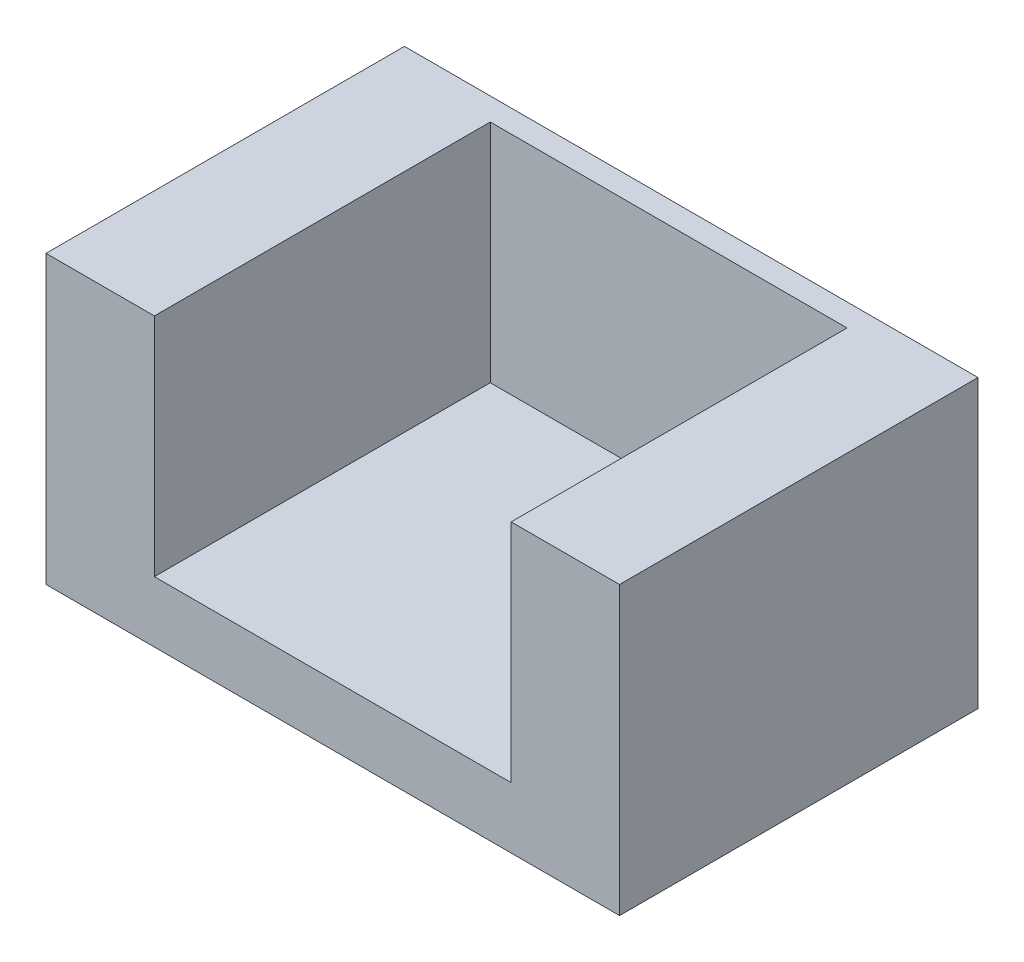
ISO-10303-21;
HEADER;
FILE_DESCRIPTION(('STEP AP214'),'2;1');
FILE_NAME('part.step','',(''),(''),'','','');
FILE_SCHEMA(('AUTOMOTIVE_DESIGN { 1 0 10303 214 1 1 1 1 }'));
ENDSEC;
DATA;
#1=APPLICATION_CONTEXT('core data for automotive mechanical design processes');
#2=APPLICATION_PROTOCOL_DEFINITION('international standard','automotive_design',2000,#1);
#3=PRODUCT_CONTEXT('',#1,'mechanical');
#4=PRODUCT('Part','Part','',(#3));
#5=PRODUCT_RELATED_PRODUCT_CATEGORY('part','',(#4));
#6=PRODUCT_DEFINITION_FORMATION('','',#4);
#7=PRODUCT_DEFINITION_CONTEXT('part definition',#1,'design');
#8=PRODUCT_DEFINITION('design','',#6,#7);
#9=PRODUCT_DEFINITION_SHAPE('','',#8);
#10=(LENGTH_UNIT() NAMED_UNIT(*) SI_UNIT(.MILLI.,.METRE.));
#11=(NAMED_UNIT(*) PLANE_ANGLE_UNIT() SI_UNIT($,.RADIAN.));
#12=(NAMED_UNIT(*) SI_UNIT($,.STERADIAN.) SOLID_ANGLE_UNIT());
#13=UNCERTAINTY_MEASURE_WITH_UNIT(LENGTH_MEASURE(1.E-05),#10,'distance_accuracy_value','');
#14=(GEOMETRIC_REPRESENTATION_CONTEXT(3) GLOBAL_UNCERTAINTY_ASSIGNED_CONTEXT((#13)) GLOBAL_UNIT_ASSIGNED_CONTEXT((#10,
#11,#12)) REPRESENTATION_CONTEXT('',''));
#15=CARTESIAN_POINT('',(0.,0.,0.));
#16=DIRECTION('',(0.,0.,1.));
#17=DIRECTION('',(1.,0.,0.));
#18=AXIS2_PLACEMENT_3D('',#15,#16,#17);
#19=CARTESIAN_POINT('',(-19.0931202727902,12.7,-5.97680945074069));
#20=DIRECTION('',(1.,0.,0.));
#21=DIRECTION('',(0.,0.,-1.));
#22=AXIS2_PLACEMENT_3D('',#19,#20,#21);
#23=PLANE('',#22);
#24=DIRECTION('',(0.,0.,1.));
#25=VECTOR('',#24,1.);
#26=CARTESIAN_POINT('',(-19.0931202727902,0.,-5.97680945074069));
#27=LINE('',#26,#25);
#28=CARTESIAN_POINT('',(-19.0931202727902,0.,-5.97680945074069));
#29=VERTEX_POINT('',#28);
#30=CARTESIAN_POINT('',(-19.0931202727902,0.,9.89819054925931));
#31=VERTEX_POINT('',#30);
#32=EDGE_CURVE('E141',#29,#31,#27,.T.);
#33=ORIENTED_EDGE('',*,*,#32,.T.);
#34=DIRECTION('',(0.,-1.,0.));
#35=VECTOR('',#34,1.);
#36=CARTESIAN_POINT('',(-19.0931202727902,12.7,9.89819054925931));
#37=LINE('',#36,#35);
#38=CARTESIAN_POINT('',(-19.0931202727902,12.7,9.89819054925931));
#39=VERTEX_POINT('',#38);
#40=EDGE_CURVE('E11',#39,#31,#37,.T.);
#41=ORIENTED_EDGE('',*,*,#40,.F.);
#42=DIRECTION('',(0.,0.,1.));
#43=VECTOR('',#42,1.);
#44=CARTESIAN_POINT('',(-19.0931202727902,12.7,-5.97680945074069));
#45=LINE('',#44,#43);
#46=CARTESIAN_POINT('',(-19.0931202727902,12.7,-5.97680945074069));
#47=VERTEX_POINT('',#46);
#48=EDGE_CURVE('E145',#47,#39,#45,.T.);
#49=ORIENTED_EDGE('',*,*,#48,.F.);
#50=DIRECTION('',(0.,-1.,0.));
#51=VECTOR('',#50,1.);
#52=CARTESIAN_POINT('',(-19.0931202727902,12.7,-5.97680945074069));
#53=LINE('',#52,#51);
#54=EDGE_CURVE('E152',#47,#29,#53,.T.);
#55=ORIENTED_EDGE('',*,*,#54,.T.);
#56=EDGE_LOOP('',(#33,#41,#49,#55));
#57=FACE_BOUND('',#56,.T.);
#58=ADVANCED_FACE('F35',(#57),#23,.F.);
#59=CARTESIAN_POINT('',(-19.0931202727902,12.7,9.89819054925931));
#60=DIRECTION('',(0.,0.,-1.));
#61=DIRECTION('',(-1.,0.,0.));
#62=AXIS2_PLACEMENT_3D('',#59,#60,#61);
#63=PLANE('',#62);
#64=DIRECTION('',(1.,0.,0.));
#65=VECTOR('',#64,1.);
#66=CARTESIAN_POINT('',(-14.2931202727902,2.7,9.89819054925931));
#67=LINE('',#66,#65);
#68=CARTESIAN_POINT('',(-14.2931202727902,2.7,9.89819054925931));
#69=VERTEX_POINT('',#68);
#70=CARTESIAN_POINT('',(1.50687972720984,2.7,9.89819054925931));
#71=VERTEX_POINT('',#70);
#72=EDGE_CURVE('E123',#69,#71,#67,.T.);
#73=ORIENTED_EDGE('',*,*,#72,.F.);
#74=DIRECTION('',(0.,1.,0.));
#75=VECTOR('',#74,1.);
#76=CARTESIAN_POINT('',(-14.2931202727902,2.7,9.89819054925931));
#77=LINE('',#76,#75);
#78=CARTESIAN_POINT('',(-14.2931202727902,12.7,9.89819054925931));
#79=VERTEX_POINT('',#78);
#80=EDGE_CURVE('E109',#69,#79,#77,.T.);
#81=ORIENTED_EDGE('',*,*,#80,.T.);
#82=DIRECTION('',(1.,0.,0.));
#83=VECTOR('',#82,1.);
#84=CARTESIAN_POINT('',(-19.0931202727902,12.7,9.89819054925931));
#85=LINE('',#84,#83);
#86=EDGE_CURVE('E86',#39,#79,#85,.T.);
#87=ORIENTED_EDGE('',*,*,#86,.F.);
#88=ORIENTED_EDGE('',*,*,#40,.T.);
#89=DIRECTION('',(1.,0.,0.));
#90=VECTOR('',#89,1.);
#91=CARTESIAN_POINT('',(-19.0931202727902,0.,9.89819054925931));
#92=LINE('',#91,#90);
#93=CARTESIAN_POINT('',(6.30687972720984,0.,9.89819054925931));
#94=VERTEX_POINT('',#93);
#95=EDGE_CURVE('E155',#31,#94,#92,.T.);
#96=ORIENTED_EDGE('',*,*,#95,.T.);
#97=DIRECTION('',(0.,-1.,0.));
#98=VECTOR('',#97,1.);
#99=CARTESIAN_POINT('',(6.30687972720984,12.7,9.89819054925931));
#100=LINE('',#99,#98);
#101=CARTESIAN_POINT('',(6.30687972720984,12.7,9.89819054925931));
#102=VERTEX_POINT('',#101);
#103=EDGE_CURVE('E42',#102,#94,#100,.T.);
#104=ORIENTED_EDGE('',*,*,#103,.F.);
#105=CARTESIAN_POINT('',(1.50687972720984,12.7,9.89819054925931));
#106=VERTEX_POINT('',#105);
#107=EDGE_CURVE('E147',#106,#102,#85,.T.);
#108=ORIENTED_EDGE('',*,*,#107,.F.);
#109=DIRECTION('',(0.,1.,0.));
#110=VECTOR('',#109,1.);
#111=CARTESIAN_POINT('',(1.50687972720984,2.7,9.89819054925931));
#112=LINE('',#111,#110);
#113=EDGE_CURVE('E49',#71,#106,#112,.T.);
#114=ORIENTED_EDGE('',*,*,#113,.F.);
#115=EDGE_LOOP('',(#73,#81,#87,#88,#96,#104,#108,#114));
#116=FACE_BOUND('',#115,.T.);
#117=ADVANCED_FACE('F127',(#116),#63,.F.);
#118=CARTESIAN_POINT('',(6.30687972720984,12.7,-5.97680945074069));
#119=DIRECTION('',(-1.,0.,0.));
#120=DIRECTION('',(0.,0.,1.));
#121=AXIS2_PLACEMENT_3D('',#118,#119,#120);
#122=PLANE('',#121);
#123=DIRECTION('',(0.,0.,-1.));
#124=VECTOR('',#123,1.);
#125=CARTESIAN_POINT('',(6.30687972720984,0.,-5.97680945074069));
#126=LINE('',#125,#124);
#127=CARTESIAN_POINT('',(6.30687972720984,0.,-5.97680945074069));
#128=VERTEX_POINT('',#127);
#129=EDGE_CURVE('E157',#94,#128,#126,.T.);
#130=ORIENTED_EDGE('',*,*,#129,.T.);
#131=DIRECTION('',(0.,-1.,0.));
#132=VECTOR('',#131,1.);
#133=CARTESIAN_POINT('',(6.30687972720984,12.7,-5.97680945074069));
#134=LINE('',#133,#132);
#135=CARTESIAN_POINT('',(6.30687972720984,12.7,-5.97680945074069));
#136=VERTEX_POINT('',#135);
#137=EDGE_CURVE('E161',#136,#128,#134,.T.);
#138=ORIENTED_EDGE('',*,*,#137,.F.);
#139=DIRECTION('',(0.,0.,-1.));
#140=VECTOR('',#139,1.);
#141=CARTESIAN_POINT('',(6.30687972720984,12.7,-5.97680945074069));
#142=LINE('',#141,#140);
#143=EDGE_CURVE('E149',#102,#136,#142,.T.);
#144=ORIENTED_EDGE('',*,*,#143,.F.);
#145=ORIENTED_EDGE('',*,*,#103,.T.);
#146=EDGE_LOOP('',(#130,#138,#144,#145));
#147=FACE_BOUND('',#146,.T.);
#148=ADVANCED_FACE('F167',(#147),#122,.F.);
#149=CARTESIAN_POINT('',(-19.0931202727902,12.7,-5.97680945074069));
#150=DIRECTION('',(0.,0.,1.));
#151=DIRECTION('',(1.,0.,0.));
#152=AXIS2_PLACEMENT_3D('',#149,#150,#151);
#153=PLANE('',#152);
#154=DIRECTION('',(-1.,0.,0.));
#155=VECTOR('',#154,1.);
#156=CARTESIAN_POINT('',(-19.0931202727902,0.,-5.97680945074069));
#157=LINE('',#156,#155);
#158=EDGE_CURVE('E79',#128,#29,#157,.T.);
#159=ORIENTED_EDGE('',*,*,#158,.T.);
#160=ORIENTED_EDGE('',*,*,#54,.F.);
#161=DIRECTION('',(-1.,0.,0.));
#162=VECTOR('',#161,1.);
#163=CARTESIAN_POINT('',(-19.0931202727902,12.7,-5.97680945074069));
#164=LINE('',#163,#162);
#165=EDGE_CURVE('E58',#136,#47,#164,.T.);
#166=ORIENTED_EDGE('',*,*,#165,.F.);
#167=ORIENTED_EDGE('',*,*,#137,.T.);
#168=EDGE_LOOP('',(#159,#160,#166,#167));
#169=FACE_BOUND('',#168,.T.);
#170=ADVANCED_FACE('F175',(#169),#153,.F.);
#171=CARTESIAN_POINT('',(0.,12.7,0.));
#172=DIRECTION('',(0.,1.,0.));
#173=DIRECTION('',(0.,0.,1.));
#174=AXIS2_PLACEMENT_3D('',#171,#172,#173);
#175=PLANE('',#174);
#176=DIRECTION('',(0.,0.,1.));
#177=VECTOR('',#176,1.);
#178=CARTESIAN_POINT('',(-14.2931202727902,12.7,-4.97680945074069));
#179=LINE('',#178,#177);
#180=CARTESIAN_POINT('',(-14.2931202727902,12.7,-4.97680945074069));
#181=VERTEX_POINT('',#180);
#182=EDGE_CURVE('E115',#181,#79,#179,.T.);
#183=ORIENTED_EDGE('',*,*,#182,.F.);
#184=DIRECTION('',(-1.,0.,0.));
#185=VECTOR('',#184,1.);
#186=CARTESIAN_POINT('',(-14.2931202727902,12.7,-4.97680945074069));
#187=LINE('',#186,#185);
#188=CARTESIAN_POINT('',(1.50687972720984,12.7,-4.97680945074069));
#189=VERTEX_POINT('',#188);
#190=EDGE_CURVE('E125',#189,#181,#187,.T.);
#191=ORIENTED_EDGE('',*,*,#190,.F.);
#192=DIRECTION('',(0.,0.,-1.));
#193=VECTOR('',#192,1.);
#194=CARTESIAN_POINT('',(1.50687972720984,12.7,-4.97680945074069));
#195=LINE('',#194,#193);
#196=EDGE_CURVE('E135',#106,#189,#195,.T.);
#197=ORIENTED_EDGE('',*,*,#196,.F.);
#198=ORIENTED_EDGE('',*,*,#107,.T.);
#199=ORIENTED_EDGE('',*,*,#143,.T.);
#200=ORIENTED_EDGE('',*,*,#165,.T.);
#201=ORIENTED_EDGE('',*,*,#48,.T.);
#202=ORIENTED_EDGE('',*,*,#86,.T.);
#203=EDGE_LOOP('',(#183,#191,#197,#198,#199,#200,#201,#202));
#204=FACE_BOUND('',#203,.T.);
#205=ADVANCED_FACE('F177',(#204),#175,.T.);
#206=CARTESIAN_POINT('',(0.,0.,0.));
#207=DIRECTION('',(0.,1.,0.));
#208=DIRECTION('',(0.,0.,1.));
#209=AXIS2_PLACEMENT_3D('',#206,#207,#208);
#210=PLANE('',#209);
#211=ORIENTED_EDGE('',*,*,#32,.F.);
#212=ORIENTED_EDGE('',*,*,#158,.F.);
#213=ORIENTED_EDGE('',*,*,#129,.F.);
#214=ORIENTED_EDGE('',*,*,#95,.F.);
#215=EDGE_LOOP('',(#211,#212,#213,#214));
#216=FACE_BOUND('',#215,.T.);
#217=ADVANCED_FACE('F171',(#216),#210,.F.);
#218=CARTESIAN_POINT('',(-14.2931202727902,2.7,-4.97680945074069));
#219=DIRECTION('',(-1.,0.,0.));
#220=DIRECTION('',(0.,0.,1.));
#221=AXIS2_PLACEMENT_3D('',#218,#219,#220);
#222=PLANE('',#221);
#223=ORIENTED_EDGE('',*,*,#182,.T.);
#224=ORIENTED_EDGE('',*,*,#80,.F.);
#225=DIRECTION('',(0.,0.,1.));
#226=VECTOR('',#225,1.);
#227=CARTESIAN_POINT('',(-14.2931202727902,2.7,-4.97680945074069));
#228=LINE('',#227,#226);
#229=CARTESIAN_POINT('',(-14.2931202727902,2.7,-4.97680945074069));
#230=VERTEX_POINT('',#229);
#231=EDGE_CURVE('E112',#230,#69,#228,.T.);
#232=ORIENTED_EDGE('',*,*,#231,.F.);
#233=DIRECTION('',(0.,1.,0.));
#234=VECTOR('',#233,1.);
#235=CARTESIAN_POINT('',(-14.2931202727902,2.7,-4.97680945074069));
#236=LINE('',#235,#234);
#237=EDGE_CURVE('E139',#230,#181,#236,.T.);
#238=ORIENTED_EDGE('',*,*,#237,.T.);
#239=EDGE_LOOP('',(#223,#224,#232,#238));
#240=FACE_BOUND('',#239,.T.);
#241=ADVANCED_FACE('F111',(#240),#222,.F.);
#242=CARTESIAN_POINT('',(-14.2931202727902,2.7,-4.97680945074069));
#243=DIRECTION('',(0.,0.,-1.));
#244=DIRECTION('',(-1.,0.,0.));
#245=AXIS2_PLACEMENT_3D('',#242,#243,#244);
#246=PLANE('',#245);
#247=ORIENTED_EDGE('',*,*,#190,.T.);
#248=ORIENTED_EDGE('',*,*,#237,.F.);
#249=DIRECTION('',(-1.,0.,0.));
#250=VECTOR('',#249,1.);
#251=CARTESIAN_POINT('',(-14.2931202727902,2.7,-4.97680945074069));
#252=LINE('',#251,#250);
#253=CARTESIAN_POINT('',(1.50687972720984,2.7,-4.97680945074069));
#254=VERTEX_POINT('',#253);
#255=EDGE_CURVE('E117',#254,#230,#252,.T.);
#256=ORIENTED_EDGE('',*,*,#255,.F.);
#257=DIRECTION('',(0.,1.,0.));
#258=VECTOR('',#257,1.);
#259=CARTESIAN_POINT('',(1.50687972720984,2.7,-4.97680945074069));
#260=LINE('',#259,#258);
#261=EDGE_CURVE('E142',#254,#189,#260,.T.);
#262=ORIENTED_EDGE('',*,*,#261,.T.);
#263=EDGE_LOOP('',(#247,#248,#256,#262));
#264=FACE_BOUND('',#263,.T.);
#265=ADVANCED_FACE('F221',(#264),#246,.F.);
#266=CARTESIAN_POINT('',(1.50687972720984,2.7,-4.97680945074069));
#267=DIRECTION('',(1.,0.,0.));
#268=DIRECTION('',(0.,0.,-1.));
#269=AXIS2_PLACEMENT_3D('',#266,#267,#268);
#270=PLANE('',#269);
#271=ORIENTED_EDGE('',*,*,#196,.T.);
#272=ORIENTED_EDGE('',*,*,#261,.F.);
#273=DIRECTION('',(0.,0.,-1.));
#274=VECTOR('',#273,1.);
#275=CARTESIAN_POINT('',(1.50687972720984,2.7,-4.97680945074069));
#276=LINE('',#275,#274);
#277=EDGE_CURVE('E129',#71,#254,#276,.T.);
#278=ORIENTED_EDGE('',*,*,#277,.F.);
#279=ORIENTED_EDGE('',*,*,#113,.T.);
#280=EDGE_LOOP('',(#271,#272,#278,#279));
#281=FACE_BOUND('',#280,.T.);
#282=ADVANCED_FACE('F227',(#281),#270,.F.);
#283=CARTESIAN_POINT('',(0.,2.7,0.));
#284=DIRECTION('',(0.,1.,0.));
#285=DIRECTION('',(0.,0.,1.));
#286=AXIS2_PLACEMENT_3D('',#283,#284,#285);
#287=PLANE('',#286);
#288=ORIENTED_EDGE('',*,*,#231,.T.);
#289=ORIENTED_EDGE('',*,*,#72,.T.);
#290=ORIENTED_EDGE('',*,*,#277,.T.);
#291=ORIENTED_EDGE('',*,*,#255,.T.);
#292=EDGE_LOOP('',(#288,#289,#290,#291));
#293=FACE_BOUND('',#292,.T.);
#294=ADVANCED_FACE('F121',(#293),#287,.T.);
#295=CLOSED_SHELL('',(#58,#117,#148,#170,#205,#217,#241,#265,#282,#294));
#296=MANIFOLD_SOLID_BREP('B2',#295);
#297=ADVANCED_BREP_SHAPE_REPRESENTATION('',(#18,#296),#14);
#298=SHAPE_DEFINITION_REPRESENTATION(#9,#297);
ENDSEC;
END-ISO-10303-21;
